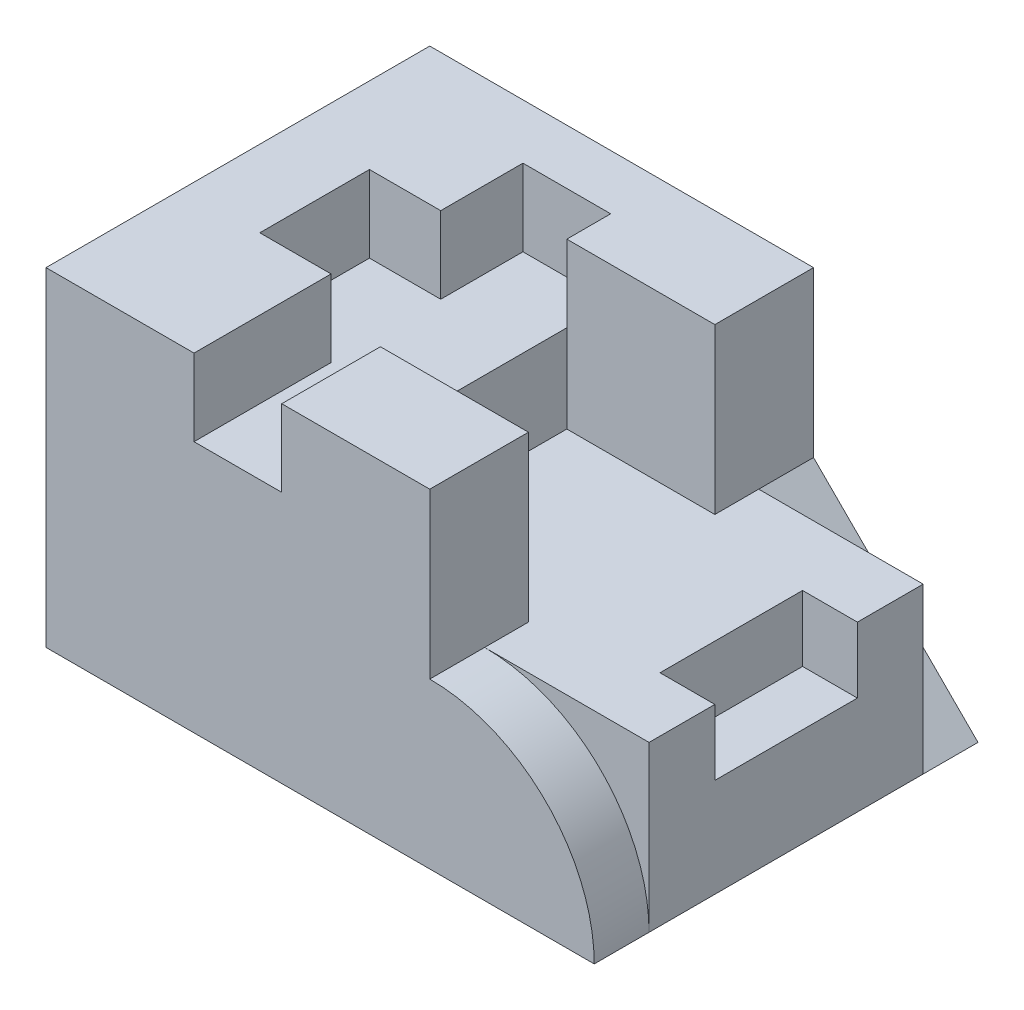
ISO-10303-21;
HEADER;
FILE_DESCRIPTION(('STEP AP214'),'2;1');
FILE_NAME('part.step','',(''),(''),'','','');
FILE_SCHEMA(('AUTOMOTIVE_DESIGN { 1 0 10303 214 1 1 1 1 }'));
ENDSEC;
DATA;
#1=APPLICATION_CONTEXT('core data for automotive mechanical design processes');
#2=APPLICATION_PROTOCOL_DEFINITION('international standard','automotive_design',2000,#1);
#3=PRODUCT_CONTEXT('',#1,'mechanical');
#4=PRODUCT('Part','Part','',(#3));
#5=PRODUCT_RELATED_PRODUCT_CATEGORY('part','',(#4));
#6=PRODUCT_DEFINITION_FORMATION('','',#4);
#7=PRODUCT_DEFINITION_CONTEXT('part definition',#1,'design');
#8=PRODUCT_DEFINITION('design','',#6,#7);
#9=PRODUCT_DEFINITION_SHAPE('','',#8);
#10=(LENGTH_UNIT() NAMED_UNIT(*) SI_UNIT(.MILLI.,.METRE.));
#11=(NAMED_UNIT(*) PLANE_ANGLE_UNIT() SI_UNIT($,.RADIAN.));
#12=(NAMED_UNIT(*) SI_UNIT($,.STERADIAN.) SOLID_ANGLE_UNIT());
#13=UNCERTAINTY_MEASURE_WITH_UNIT(LENGTH_MEASURE(1.E-05),#10,'distance_accuracy_value','');
#14=(GEOMETRIC_REPRESENTATION_CONTEXT(3) GLOBAL_UNCERTAINTY_ASSIGNED_CONTEXT((#13)) GLOBAL_UNIT_ASSIGNED_CONTEXT((#10,
#11,#12)) REPRESENTATION_CONTEXT('',''));
#15=CARTESIAN_POINT('',(0.,0.,0.));
#16=DIRECTION('',(0.,0.,1.));
#17=DIRECTION('',(1.,0.,0.));
#18=AXIS2_PLACEMENT_3D('',#15,#16,#17);
#19=CARTESIAN_POINT('',(0.,0.,35.));
#20=DIRECTION('',(0.,0.,-1.));
#21=DIRECTION('',(-1.,0.,0.));
#22=AXIS2_PLACEMENT_3D('',#19,#20,#21);
#23=PLANE('',#22);
#24=CARTESIAN_POINT('',(10.,-15.,35.));
#25=DIRECTION('',(0.,0.,1.));
#26=DIRECTION('',(1.,0.,0.));
#27=AXIS2_PLACEMENT_3D('',#24,#25,#26);
#28=CIRCLE('',#27,15.);
#29=CARTESIAN_POINT('',(25.,-15.,35.));
#30=VERTEX_POINT('',#29);
#31=CARTESIAN_POINT('',(10.,0.,35.));
#32=VERTEX_POINT('',#31);
#33=EDGE_CURVE('E229',#30,#32,#28,.T.);
#34=ORIENTED_EDGE('',*,*,#33,.T.);
#35=DIRECTION('',(0.,-1.,0.));
#36=VECTOR('',#35,1.);
#37=CARTESIAN_POINT('',(10.,15.,35.));
#38=LINE('',#37,#36);
#39=CARTESIAN_POINT('',(10.,15.,35.));
#40=VERTEX_POINT('',#39);
#41=EDGE_CURVE('E268',#40,#32,#38,.T.);
#42=ORIENTED_EDGE('',*,*,#41,.F.);
#43=DIRECTION('',(-1.,0.,0.));
#44=VECTOR('',#43,1.);
#45=CARTESIAN_POINT('',(-25.,15.,35.));
#46=LINE('',#45,#44);
#47=CARTESIAN_POINT('',(-3.5,15.,35.));
#48=VERTEX_POINT('',#47);
#49=EDGE_CURVE('E251',#40,#48,#46,.T.);
#50=ORIENTED_EDGE('',*,*,#49,.T.);
#51=DIRECTION('',(0.,1.,0.));
#52=VECTOR('',#51,1.);
#53=CARTESIAN_POINT('',(-3.5,8.,35.));
#54=LINE('',#53,#52);
#55=CARTESIAN_POINT('',(-3.5,8.,35.));
#56=VERTEX_POINT('',#55);
#57=EDGE_CURVE('E279',#56,#48,#54,.T.);
#58=ORIENTED_EDGE('',*,*,#57,.F.);
#59=DIRECTION('',(1.,0.,0.));
#60=VECTOR('',#59,1.);
#61=CARTESIAN_POINT('',(0.,8.,35.));
#62=LINE('',#61,#60);
#63=CARTESIAN_POINT('',(-11.5,8.,35.));
#64=VERTEX_POINT('',#63);
#65=EDGE_CURVE('E335',#64,#56,#62,.T.);
#66=ORIENTED_EDGE('',*,*,#65,.F.);
#67=DIRECTION('',(0.,1.,0.));
#68=VECTOR('',#67,1.);
#69=CARTESIAN_POINT('',(-11.5,8.,35.));
#70=LINE('',#69,#68);
#71=CARTESIAN_POINT('',(-11.5,15.,35.));
#72=VERTEX_POINT('',#71);
#73=EDGE_CURVE('E276',#64,#72,#70,.T.);
#74=ORIENTED_EDGE('',*,*,#73,.T.);
#75=CARTESIAN_POINT('',(-25.,15.,35.));
#76=VERTEX_POINT('',#75);
#77=EDGE_CURVE('E250',#72,#76,#46,.T.);
#78=ORIENTED_EDGE('',*,*,#77,.T.);
#79=DIRECTION('',(0.,-1.,0.));
#80=VECTOR('',#79,1.);
#81=CARTESIAN_POINT('',(-25.,-15.,35.));
#82=LINE('',#81,#80);
#83=CARTESIAN_POINT('',(-25.,-15.,35.));
#84=VERTEX_POINT('',#83);
#85=EDGE_CURVE('E236',#76,#84,#82,.T.);
#86=ORIENTED_EDGE('',*,*,#85,.T.);
#87=DIRECTION('',(1.,0.,0.));
#88=VECTOR('',#87,1.);
#89=CARTESIAN_POINT('',(-25.,-15.,35.));
#90=LINE('',#89,#88);
#91=EDGE_CURVE('E233',#84,#30,#90,.T.);
#92=ORIENTED_EDGE('',*,*,#91,.T.);
#93=EDGE_LOOP('',(#34,#42,#50,#58,#66,#74,#78,#86,#92));
#94=FACE_BOUND('',#93,.T.);
#95=ADVANCED_FACE('F32',(#94),#23,.F.);
#96=CARTESIAN_POINT('',(25.,-15.,35.));
#97=DIRECTION('',(-1.,0.,0.));
#98=DIRECTION('',(0.,0.,1.));
#99=AXIS2_PLACEMENT_3D('',#96,#97,#98);
#100=PLANE('',#99);
#101=DIRECTION('',(0.,0.,-1.));
#102=VECTOR('',#101,1.);
#103=CARTESIAN_POINT('',(25.,-15.,35.));
#104=LINE('',#103,#102);
#105=CARTESIAN_POINT('',(25.,-15.,30.));
#106=VERTEX_POINT('',#105);
#107=CARTESIAN_POINT('',(25.,-15.,5.));
#108=VERTEX_POINT('',#107);
#109=EDGE_CURVE('E225',#106,#108,#104,.T.);
#110=ORIENTED_EDGE('',*,*,#109,.T.);
#111=DIRECTION('',(0.,-1.,0.));
#112=VECTOR('',#111,1.);
#113=CARTESIAN_POINT('',(25.,0.,5.));
#114=LINE('',#113,#112);
#115=CARTESIAN_POINT('',(25.,0.,5.));
#116=VERTEX_POINT('',#115);
#117=EDGE_CURVE('E211',#116,#108,#114,.T.);
#118=ORIENTED_EDGE('',*,*,#117,.F.);
#119=DIRECTION('',(0.,0.,1.));
#120=VECTOR('',#119,1.);
#121=CARTESIAN_POINT('',(25.,0.,0.));
#122=LINE('',#121,#120);
#123=CARTESIAN_POINT('',(25.,0.,11.));
#124=VERTEX_POINT('',#123);
#125=EDGE_CURVE('E254',#116,#124,#122,.T.);
#126=ORIENTED_EDGE('',*,*,#125,.T.);
#127=DIRECTION('',(0.,1.,0.));
#128=VECTOR('',#127,1.);
#129=CARTESIAN_POINT('',(25.,-6.,11.));
#130=LINE('',#129,#128);
#131=CARTESIAN_POINT('',(25.,-6.,11.));
#132=VERTEX_POINT('',#131);
#133=EDGE_CURVE('E347',#132,#124,#130,.T.);
#134=ORIENTED_EDGE('',*,*,#133,.F.);
#135=DIRECTION('',(0.,0.,-1.));
#136=VECTOR('',#135,1.);
#137=CARTESIAN_POINT('',(25.,-6.,24.));
#138=LINE('',#137,#136);
#139=CARTESIAN_POINT('',(25.,-6.,24.));
#140=VERTEX_POINT('',#139);
#141=EDGE_CURVE('E362',#140,#132,#138,.T.);
#142=ORIENTED_EDGE('',*,*,#141,.F.);
#143=DIRECTION('',(0.,1.,0.));
#144=VECTOR('',#143,1.);
#145=CARTESIAN_POINT('',(25.,-6.,24.));
#146=LINE('',#145,#144);
#147=CARTESIAN_POINT('',(25.,0.,24.));
#148=VERTEX_POINT('',#147);
#149=EDGE_CURVE('E343',#140,#148,#146,.T.);
#150=ORIENTED_EDGE('',*,*,#149,.T.);
#151=CARTESIAN_POINT('',(25.,0.,30.));
#152=VERTEX_POINT('',#151);
#153=EDGE_CURVE('E265',#148,#152,#122,.T.);
#154=ORIENTED_EDGE('',*,*,#153,.T.);
#155=DIRECTION('',(0.,1.,0.));
#156=VECTOR('',#155,1.);
#157=CARTESIAN_POINT('',(25.,0.,30.));
#158=LINE('',#157,#156);
#159=EDGE_CURVE('E47',#106,#152,#158,.T.);
#160=ORIENTED_EDGE('',*,*,#159,.F.);
#161=EDGE_LOOP('',(#110,#118,#126,#134,#142,#150,#154,#160));
#162=FACE_BOUND('',#161,.T.);
#163=ADVANCED_FACE('F34',(#162),#100,.F.);
#164=CARTESIAN_POINT('',(25.,0.,0.));
#165=DIRECTION('',(0.,-1.,0.));
#166=DIRECTION('',(1.,0.,0.));
#167=AXIS2_PLACEMENT_3D('',#164,#165,#166);
#168=PLANE('',#167);
#169=ORIENTED_EDGE('',*,*,#125,.F.);
#170=DIRECTION('',(1.,0.,0.));
#171=VECTOR('',#170,1.);
#172=CARTESIAN_POINT('',(10.,0.,5.));
#173=LINE('',#172,#171);
#174=CARTESIAN_POINT('',(10.,0.,5.));
#175=VERTEX_POINT('',#174);
#176=EDGE_CURVE('E210',#175,#116,#173,.T.);
#177=ORIENTED_EDGE('',*,*,#176,.F.);
#178=DIRECTION('',(0.,0.,1.));
#179=VECTOR('',#178,1.);
#180=CARTESIAN_POINT('',(10.,0.,0.));
#181=LINE('',#180,#179);
#182=CARTESIAN_POINT('',(10.,0.,9.));
#183=VERTEX_POINT('',#182);
#184=EDGE_CURVE('E266',#175,#183,#181,.T.);
#185=ORIENTED_EDGE('',*,*,#184,.T.);
#186=DIRECTION('',(-1.,0.,0.));
#187=VECTOR('',#186,1.);
#188=CARTESIAN_POINT('',(10.,0.,9.));
#189=LINE('',#188,#187);
#190=CARTESIAN_POINT('',(-3.5,0.,9.));
#191=VERTEX_POINT('',#190);
#192=EDGE_CURVE('E378',#183,#191,#189,.T.);
#193=ORIENTED_EDGE('',*,*,#192,.T.);
#194=DIRECTION('',(0.,0.,-1.));
#195=VECTOR('',#194,1.);
#196=CARTESIAN_POINT('',(-3.5,0.,0.));
#197=LINE('',#196,#195);
#198=CARTESIAN_POINT('',(-3.5,0.,26.));
#199=VERTEX_POINT('',#198);
#200=EDGE_CURVE('E272',#199,#191,#197,.T.);
#201=ORIENTED_EDGE('',*,*,#200,.F.);
#202=DIRECTION('',(1.,0.,0.));
#203=VECTOR('',#202,1.);
#204=CARTESIAN_POINT('',(10.,0.,26.));
#205=LINE('',#204,#203);
#206=CARTESIAN_POINT('',(10.,0.,26.));
#207=VERTEX_POINT('',#206);
#208=EDGE_CURVE('E376',#199,#207,#205,.T.);
#209=ORIENTED_EDGE('',*,*,#208,.T.);
#210=CARTESIAN_POINT('',(10.,0.,30.));
#211=VERTEX_POINT('',#210);
#212=EDGE_CURVE('E262',#207,#211,#181,.T.);
#213=ORIENTED_EDGE('',*,*,#212,.T.);
#214=DIRECTION('',(-1.,0.,0.));
#215=VECTOR('',#214,1.);
#216=CARTESIAN_POINT('',(0.,0.,30.));
#217=LINE('',#216,#215);
#218=EDGE_CURVE('E391',#152,#211,#217,.T.);
#219=ORIENTED_EDGE('',*,*,#218,.F.);
#220=ORIENTED_EDGE('',*,*,#153,.F.);
#221=DIRECTION('',(1.,0.,0.));
#222=VECTOR('',#221,1.);
#223=CARTESIAN_POINT('',(25.,0.,24.));
#224=LINE('',#223,#222);
#225=CARTESIAN_POINT('',(20.,0.,24.));
#226=VERTEX_POINT('',#225);
#227=EDGE_CURVE('E355',#226,#148,#224,.T.);
#228=ORIENTED_EDGE('',*,*,#227,.F.);
#229=DIRECTION('',(0.,0.,1.));
#230=VECTOR('',#229,1.);
#231=CARTESIAN_POINT('',(20.,0.,24.));
#232=LINE('',#231,#230);
#233=CARTESIAN_POINT('',(20.,0.,11.));
#234=VERTEX_POINT('',#233);
#235=EDGE_CURVE('E357',#234,#226,#232,.T.);
#236=ORIENTED_EDGE('',*,*,#235,.F.);
#237=DIRECTION('',(-1.,0.,0.));
#238=VECTOR('',#237,1.);
#239=CARTESIAN_POINT('',(25.,0.,11.));
#240=LINE('',#239,#238);
#241=EDGE_CURVE('E351',#124,#234,#240,.T.);
#242=ORIENTED_EDGE('',*,*,#241,.F.);
#243=EDGE_LOOP('',(#169,#177,#185,#193,#201,#209,#213,#219,#220,#228,#236,#242));
#244=FACE_BOUND('',#243,.T.);
#245=ADVANCED_FACE('F448',(#244),#168,.F.);
#246=CARTESIAN_POINT('',(-25.,15.,35.));
#247=DIRECTION('',(0.,-1.,0.));
#248=DIRECTION('',(0.,0.,-1.));
#249=AXIS2_PLACEMENT_3D('',#246,#247,#248);
#250=PLANE('',#249);
#251=DIRECTION('',(0.,0.,-1.));
#252=VECTOR('',#251,1.);
#253=CARTESIAN_POINT('',(-3.5,15.,0.));
#254=LINE('',#253,#252);
#255=CARTESIAN_POINT('',(-3.5,15.,9.));
#256=VERTEX_POINT('',#255);
#257=CARTESIAN_POINT('',(-3.5,15.,5.));
#258=VERTEX_POINT('',#257);
#259=EDGE_CURVE('E314',#256,#258,#254,.T.);
#260=ORIENTED_EDGE('',*,*,#259,.F.);
#261=DIRECTION('',(-1.,0.,0.));
#262=VECTOR('',#261,1.);
#263=CARTESIAN_POINT('',(10.,15.,9.));
#264=LINE('',#263,#262);
#265=CARTESIAN_POINT('',(10.,15.,9.));
#266=VERTEX_POINT('',#265);
#267=EDGE_CURVE('E385',#266,#256,#264,.T.);
#268=ORIENTED_EDGE('',*,*,#267,.F.);
#269=DIRECTION('',(0.,0.,1.));
#270=VECTOR('',#269,1.);
#271=CARTESIAN_POINT('',(10.,15.,0.));
#272=LINE('',#271,#270);
#273=CARTESIAN_POINT('',(10.,15.,0.));
#274=VERTEX_POINT('',#273);
#275=EDGE_CURVE('E259',#274,#266,#272,.T.);
#276=ORIENTED_EDGE('',*,*,#275,.F.);
#277=DIRECTION('',(-1.,0.,0.));
#278=VECTOR('',#277,1.);
#279=CARTESIAN_POINT('',(-25.,15.,0.));
#280=LINE('',#279,#278);
#281=CARTESIAN_POINT('',(-25.,15.,0.));
#282=VERTEX_POINT('',#281);
#283=EDGE_CURVE('E253',#274,#282,#280,.T.);
#284=ORIENTED_EDGE('',*,*,#283,.T.);
#285=DIRECTION('',(0.,0.,-1.));
#286=VECTOR('',#285,1.);
#287=CARTESIAN_POINT('',(-25.,15.,35.));
#288=LINE('',#287,#286);
#289=EDGE_CURVE('E11',#76,#282,#288,.T.);
#290=ORIENTED_EDGE('',*,*,#289,.F.);
#291=ORIENTED_EDGE('',*,*,#77,.F.);
#292=DIRECTION('',(0.,0.,-1.));
#293=VECTOR('',#292,1.);
#294=CARTESIAN_POINT('',(-11.5,15.,0.));
#295=LINE('',#294,#293);
#296=CARTESIAN_POINT('',(-11.5,15.,22.5));
#297=VERTEX_POINT('',#296);
#298=EDGE_CURVE('E315',#72,#297,#295,.T.);
#299=ORIENTED_EDGE('',*,*,#298,.T.);
#300=DIRECTION('',(-1.,0.,0.));
#301=VECTOR('',#300,1.);
#302=CARTESIAN_POINT('',(0.,15.,22.5));
#303=LINE('',#302,#301);
#304=CARTESIAN_POINT('',(-18.,15.,22.5));
#305=VERTEX_POINT('',#304);
#306=EDGE_CURVE('E295',#297,#305,#303,.T.);
#307=ORIENTED_EDGE('',*,*,#306,.T.);
#308=DIRECTION('',(0.,0.,-1.));
#309=VECTOR('',#308,1.);
#310=CARTESIAN_POINT('',(-18.,15.,0.));
#311=LINE('',#310,#309);
#312=CARTESIAN_POINT('',(-18.,15.,12.5));
#313=VERTEX_POINT('',#312);
#314=EDGE_CURVE('E299',#305,#313,#311,.T.);
#315=ORIENTED_EDGE('',*,*,#314,.T.);
#316=DIRECTION('',(-1.,0.,0.));
#317=VECTOR('',#316,1.);
#318=CARTESIAN_POINT('',(0.,15.,12.5));
#319=LINE('',#318,#317);
#320=CARTESIAN_POINT('',(-11.5,15.,12.5));
#321=VERTEX_POINT('',#320);
#322=EDGE_CURVE('E302',#321,#313,#319,.T.);
#323=ORIENTED_EDGE('',*,*,#322,.F.);
#324=DIRECTION('',(0.,0.,-1.));
#325=VECTOR('',#324,1.);
#326=CARTESIAN_POINT('',(-11.5,15.,0.));
#327=LINE('',#326,#325);
#328=CARTESIAN_POINT('',(-11.5,15.,5.00000000000001));
#329=VERTEX_POINT('',#328);
#330=EDGE_CURVE('E305',#321,#329,#327,.T.);
#331=ORIENTED_EDGE('',*,*,#330,.T.);
#332=DIRECTION('',(-1.,0.,0.));
#333=VECTOR('',#332,1.);
#334=CARTESIAN_POINT('',(0.,15.,5.));
#335=LINE('',#334,#333);
#336=EDGE_CURVE('E308',#258,#329,#335,.T.);
#337=ORIENTED_EDGE('',*,*,#336,.F.);
#338=EDGE_LOOP('',(#260,#268,#276,#284,#290,#291,#299,#307,#315,#323,#331,#337));
#339=FACE_BOUND('',#338,.T.);
#340=ADVANCED_FACE('F407',(#339),#250,.F.);
#341=CARTESIAN_POINT('',(-3.5,-16.8002976164115,0.));
#342=DIRECTION('',(1.,0.,0.));
#343=DIRECTION('',(0.,0.,-1.));
#344=AXIS2_PLACEMENT_3D('',#341,#342,#343);
#345=PLANE('',#344);
#346=ORIENTED_EDGE('',*,*,#200,.T.);
#347=DIRECTION('',(0.,1.,0.));
#348=VECTOR('',#347,1.);
#349=CARTESIAN_POINT('',(-3.5,-21.7082933460924,9.));
#350=LINE('',#349,#348);
#351=CARTESIAN_POINT('',(-3.5,8.,9.));
#352=VERTEX_POINT('',#351);
#353=EDGE_CURVE('E55',#191,#352,#350,.T.);
#354=ORIENTED_EDGE('',*,*,#353,.T.);
#355=DIRECTION('',(0.,0.,-1.));
#356=VECTOR('',#355,1.);
#357=CARTESIAN_POINT('',(-3.5,8.,0.));
#358=LINE('',#357,#356);
#359=CARTESIAN_POINT('',(-3.5,8.,26.));
#360=VERTEX_POINT('',#359);
#361=EDGE_CURVE('E333',#360,#352,#358,.T.);
#362=ORIENTED_EDGE('',*,*,#361,.F.);
#363=DIRECTION('',(0.,1.,0.));
#364=VECTOR('',#363,1.);
#365=CARTESIAN_POINT('',(-3.5,-21.7082933460924,26.));
#366=LINE('',#365,#364);
#367=EDGE_CURVE('E359',#199,#360,#366,.T.);
#368=ORIENTED_EDGE('',*,*,#367,.F.);
#369=EDGE_LOOP('',(#346,#354,#362,#368));
#370=FACE_BOUND('',#369,.T.);
#371=ADVANCED_FACE('F472',(#370),#345,.T.);
#372=CARTESIAN_POINT('',(10.,15.,0.));
#373=DIRECTION('',(-1.,0.,0.));
#374=DIRECTION('',(0.,-1.,0.));
#375=AXIS2_PLACEMENT_3D('',#372,#373,#374);
#376=PLANE('',#375);
#377=ORIENTED_EDGE('',*,*,#212,.F.);
#378=DIRECTION('',(0.,1.,0.));
#379=VECTOR('',#378,1.);
#380=CARTESIAN_POINT('',(10.,-21.7082933460924,26.));
#381=LINE('',#380,#379);
#382=CARTESIAN_POINT('',(10.,15.,26.));
#383=VERTEX_POINT('',#382);
#384=EDGE_CURVE('E372',#207,#383,#381,.T.);
#385=ORIENTED_EDGE('',*,*,#384,.T.);
#386=EDGE_CURVE('E263',#383,#40,#272,.T.);
#387=ORIENTED_EDGE('',*,*,#386,.T.);
#388=ORIENTED_EDGE('',*,*,#41,.T.);
#389=DIRECTION('',(0.,0.,1.));
#390=VECTOR('',#389,1.);
#391=CARTESIAN_POINT('',(10.,0.,30.));
#392=LINE('',#391,#390);
#393=EDGE_CURVE('E388',#211,#32,#392,.T.);
#394=ORIENTED_EDGE('',*,*,#393,.F.);
#395=EDGE_LOOP('',(#377,#385,#387,#388,#394));
#396=FACE_BOUND('',#395,.T.);
#397=ADVANCED_FACE('F455',(#396),#376,.F.);
#398=ORIENTED_EDGE('',*,*,#386,.F.);
#399=DIRECTION('',(1.,0.,0.));
#400=VECTOR('',#399,1.);
#401=CARTESIAN_POINT('',(10.,15.,26.));
#402=LINE('',#401,#400);
#403=CARTESIAN_POINT('',(-3.5,15.,26.));
#404=VERTEX_POINT('',#403);
#405=EDGE_CURVE('E386',#404,#383,#402,.T.);
#406=ORIENTED_EDGE('',*,*,#405,.F.);
#407=EDGE_CURVE('E311',#48,#404,#254,.T.);
#408=ORIENTED_EDGE('',*,*,#407,.F.);
#409=ORIENTED_EDGE('',*,*,#49,.F.);
#410=EDGE_LOOP('',(#398,#406,#408,#409));
#411=FACE_BOUND('',#410,.T.);
#412=ADVANCED_FACE('F464',(#411),#250,.F.);
#413=CARTESIAN_POINT('',(-25.,-15.,35.));
#414=DIRECTION('',(1.,0.,0.));
#415=DIRECTION('',(0.,0.,-1.));
#416=AXIS2_PLACEMENT_3D('',#413,#414,#415);
#417=PLANE('',#416);
#418=DIRECTION('',(0.,-1.,0.));
#419=VECTOR('',#418,1.);
#420=CARTESIAN_POINT('',(-25.,-15.,0.));
#421=LINE('',#420,#419);
#422=CARTESIAN_POINT('',(-25.,-15.,0.));
#423=VERTEX_POINT('',#422);
#424=EDGE_CURVE('E248',#282,#423,#421,.T.);
#425=ORIENTED_EDGE('',*,*,#424,.T.);
#426=DIRECTION('',(0.,0.,-1.));
#427=VECTOR('',#426,1.);
#428=CARTESIAN_POINT('',(-25.,-15.,35.));
#429=LINE('',#428,#427);
#430=EDGE_CURVE('E40',#84,#423,#429,.T.);
#431=ORIENTED_EDGE('',*,*,#430,.F.);
#432=ORIENTED_EDGE('',*,*,#85,.F.);
#433=ORIENTED_EDGE('',*,*,#289,.T.);
#434=EDGE_LOOP('',(#425,#431,#432,#433));
#435=FACE_BOUND('',#434,.T.);
#436=ADVANCED_FACE('F410',(#435),#417,.F.);
#437=CARTESIAN_POINT('',(-25.,-15.,35.));
#438=DIRECTION('',(0.,1.,0.));
#439=DIRECTION('',(0.,0.,1.));
#440=AXIS2_PLACEMENT_3D('',#437,#438,#439);
#441=PLANE('',#440);
#442=DIRECTION('',(1.,0.,0.));
#443=VECTOR('',#442,1.);
#444=CARTESIAN_POINT('',(-25.,-15.,0.));
#445=LINE('',#444,#443);
#446=CARTESIAN_POINT('',(25.,-15.,0.));
#447=VERTEX_POINT('',#446);
#448=EDGE_CURVE('E228',#423,#447,#445,.T.);
#449=ORIENTED_EDGE('',*,*,#448,.T.);
#450=DIRECTION('',(0.,0.,-1.));
#451=VECTOR('',#450,1.);
#452=CARTESIAN_POINT('',(25.,-15.,5.));
#453=LINE('',#452,#451);
#454=EDGE_CURVE('E204',#108,#447,#453,.T.);
#455=ORIENTED_EDGE('',*,*,#454,.F.);
#456=ORIENTED_EDGE('',*,*,#109,.F.);
#457=EDGE_CURVE('E232',#30,#106,#104,.T.);
#458=ORIENTED_EDGE('',*,*,#457,.F.);
#459=ORIENTED_EDGE('',*,*,#91,.F.);
#460=ORIENTED_EDGE('',*,*,#430,.T.);
#461=EDGE_LOOP('',(#449,#455,#456,#458,#459,#460));
#462=FACE_BOUND('',#461,.T.);
#463=ADVANCED_FACE('F223',(#462),#441,.F.);
#464=CARTESIAN_POINT('',(0.,0.,0.));
#465=DIRECTION('',(0.,0.,-1.));
#466=DIRECTION('',(-1.,0.,0.));
#467=AXIS2_PLACEMENT_3D('',#464,#465,#466);
#468=PLANE('',#467);
#469=DIRECTION('',(-0.707106781186548,0.707106781186548,0.));
#470=VECTOR('',#469,1.);
#471=CARTESIAN_POINT('',(25.,-15.,0.));
#472=LINE('',#471,#470);
#473=CARTESIAN_POINT('',(10.,0.,0.));
#474=VERTEX_POINT('',#473);
#475=EDGE_CURVE('E218',#447,#474,#472,.T.);
#476=ORIENTED_EDGE('',*,*,#475,.F.);
#477=ORIENTED_EDGE('',*,*,#448,.F.);
#478=ORIENTED_EDGE('',*,*,#424,.F.);
#479=ORIENTED_EDGE('',*,*,#283,.F.);
#480=DIRECTION('',(0.,-1.,0.));
#481=VECTOR('',#480,1.);
#482=CARTESIAN_POINT('',(10.,15.,0.));
#483=LINE('',#482,#481);
#484=EDGE_CURVE('E271',#274,#474,#483,.T.);
#485=ORIENTED_EDGE('',*,*,#484,.T.);
#486=EDGE_LOOP('',(#476,#477,#478,#479,#485));
#487=FACE_BOUND('',#486,.T.);
#488=ADVANCED_FACE('F246',(#487),#468,.T.);
#489=ORIENTED_EDGE('',*,*,#275,.T.);
#490=DIRECTION('',(0.,1.,0.));
#491=VECTOR('',#490,1.);
#492=CARTESIAN_POINT('',(10.,-21.7082933460924,9.));
#493=LINE('',#492,#491);
#494=EDGE_CURVE('E375',#183,#266,#493,.T.);
#495=ORIENTED_EDGE('',*,*,#494,.F.);
#496=ORIENTED_EDGE('',*,*,#184,.F.);
#497=EDGE_CURVE('E207',#474,#175,#181,.T.);
#498=ORIENTED_EDGE('',*,*,#497,.F.);
#499=ORIENTED_EDGE('',*,*,#484,.F.);
#500=EDGE_LOOP('',(#489,#495,#496,#498,#499));
#501=FACE_BOUND('',#500,.T.);
#502=ADVANCED_FACE('F401',(#501),#376,.F.);
#503=CARTESIAN_POINT('',(-3.5,8.,0.));
#504=DIRECTION('',(1.,0.,0.));
#505=DIRECTION('',(0.,0.,-1.));
#506=AXIS2_PLACEMENT_3D('',#503,#504,#505);
#507=PLANE('',#506);
#508=CARTESIAN_POINT('',(-3.5,8.,5.));
#509=VERTEX_POINT('',#508);
#510=EDGE_CURVE('E334',#352,#509,#358,.T.);
#511=ORIENTED_EDGE('',*,*,#510,.F.);
#512=EDGE_CURVE('E380',#352,#256,#350,.T.);
#513=ORIENTED_EDGE('',*,*,#512,.T.);
#514=ORIENTED_EDGE('',*,*,#259,.T.);
#515=DIRECTION('',(0.,1.,0.));
#516=VECTOR('',#515,1.);
#517=CARTESIAN_POINT('',(-3.5,8.,5.));
#518=LINE('',#517,#516);
#519=EDGE_CURVE('E282',#509,#258,#518,.T.);
#520=ORIENTED_EDGE('',*,*,#519,.F.);
#521=EDGE_LOOP('',(#511,#513,#514,#520));
#522=FACE_BOUND('',#521,.T.);
#523=ADVANCED_FACE('F442',(#522),#507,.F.);
#524=CARTESIAN_POINT('',(-11.5,8.,0.));
#525=DIRECTION('',(1.,0.,0.));
#526=DIRECTION('',(0.,0.,-1.));
#527=AXIS2_PLACEMENT_3D('',#524,#525,#526);
#528=PLANE('',#527);
#529=ORIENTED_EDGE('',*,*,#298,.F.);
#530=ORIENTED_EDGE('',*,*,#73,.F.);
#531=DIRECTION('',(0.,0.,-1.));
#532=VECTOR('',#531,1.);
#533=CARTESIAN_POINT('',(-11.5,8.,0.));
#534=LINE('',#533,#532);
#535=CARTESIAN_POINT('',(-11.5,8.,22.5));
#536=VERTEX_POINT('',#535);
#537=EDGE_CURVE('E298',#64,#536,#534,.T.);
#538=ORIENTED_EDGE('',*,*,#537,.T.);
#539=DIRECTION('',(0.,1.,0.));
#540=VECTOR('',#539,1.);
#541=CARTESIAN_POINT('',(-11.5,8.,22.5));
#542=LINE('',#541,#540);
#543=EDGE_CURVE('E275',#536,#297,#542,.T.);
#544=ORIENTED_EDGE('',*,*,#543,.T.);
#545=EDGE_LOOP('',(#529,#530,#538,#544));
#546=FACE_BOUND('',#545,.T.);
#547=ADVANCED_FACE('F414',(#546),#528,.T.);
#548=CARTESIAN_POINT('',(0.,8.,22.5));
#549=DIRECTION('',(0.,0.,-1.));
#550=DIRECTION('',(-1.,0.,0.));
#551=AXIS2_PLACEMENT_3D('',#548,#549,#550);
#552=PLANE('',#551);
#553=ORIENTED_EDGE('',*,*,#306,.F.);
#554=ORIENTED_EDGE('',*,*,#543,.F.);
#555=DIRECTION('',(-1.,0.,0.));
#556=VECTOR('',#555,1.);
#557=CARTESIAN_POINT('',(0.,8.,22.5));
#558=LINE('',#557,#556);
#559=CARTESIAN_POINT('',(-18.,8.,22.5));
#560=VERTEX_POINT('',#559);
#561=EDGE_CURVE('E280',#536,#560,#558,.T.);
#562=ORIENTED_EDGE('',*,*,#561,.T.);
#563=DIRECTION('',(0.,1.,0.));
#564=VECTOR('',#563,1.);
#565=CARTESIAN_POINT('',(-18.,8.,22.5));
#566=LINE('',#565,#564);
#567=EDGE_CURVE('E291',#560,#305,#566,.T.);
#568=ORIENTED_EDGE('',*,*,#567,.T.);
#569=EDGE_LOOP('',(#553,#554,#562,#568));
#570=FACE_BOUND('',#569,.T.);
#571=ADVANCED_FACE('F418',(#570),#552,.T.);
#572=CARTESIAN_POINT('',(-18.,8.,0.));
#573=DIRECTION('',(1.,0.,0.));
#574=DIRECTION('',(0.,0.,-1.));
#575=AXIS2_PLACEMENT_3D('',#572,#573,#574);
#576=PLANE('',#575);
#577=ORIENTED_EDGE('',*,*,#314,.F.);
#578=ORIENTED_EDGE('',*,*,#567,.F.);
#579=DIRECTION('',(0.,0.,-1.));
#580=VECTOR('',#579,1.);
#581=CARTESIAN_POINT('',(-18.,8.,0.));
#582=LINE('',#581,#580);
#583=CARTESIAN_POINT('',(-18.,8.,12.5));
#584=VERTEX_POINT('',#583);
#585=EDGE_CURVE('E320',#560,#584,#582,.T.);
#586=ORIENTED_EDGE('',*,*,#585,.T.);
#587=DIRECTION('',(0.,1.,0.));
#588=VECTOR('',#587,1.);
#589=CARTESIAN_POINT('',(-18.,8.,12.5));
#590=LINE('',#589,#588);
#591=EDGE_CURVE('E289',#584,#313,#590,.T.);
#592=ORIENTED_EDGE('',*,*,#591,.T.);
#593=EDGE_LOOP('',(#577,#578,#586,#592));
#594=FACE_BOUND('',#593,.T.);
#595=ADVANCED_FACE('F423',(#594),#576,.T.);
#596=CARTESIAN_POINT('',(0.,8.,12.5));
#597=DIRECTION('',(0.,0.,-1.));
#598=DIRECTION('',(-1.,0.,0.));
#599=AXIS2_PLACEMENT_3D('',#596,#597,#598);
#600=PLANE('',#599);
#601=ORIENTED_EDGE('',*,*,#322,.T.);
#602=ORIENTED_EDGE('',*,*,#591,.F.);
#603=DIRECTION('',(-1.,0.,0.));
#604=VECTOR('',#603,1.);
#605=CARTESIAN_POINT('',(0.,8.,12.5));
#606=LINE('',#605,#604);
#607=CARTESIAN_POINT('',(-11.5,8.,12.5));
#608=VERTEX_POINT('',#607);
#609=EDGE_CURVE('E322',#608,#584,#606,.T.);
#610=ORIENTED_EDGE('',*,*,#609,.F.);
#611=DIRECTION('',(0.,1.,0.));
#612=VECTOR('',#611,1.);
#613=CARTESIAN_POINT('',(-11.5,8.,12.5));
#614=LINE('',#613,#612);
#615=EDGE_CURVE('E287',#608,#321,#614,.T.);
#616=ORIENTED_EDGE('',*,*,#615,.T.);
#617=EDGE_LOOP('',(#601,#602,#610,#616));
#618=FACE_BOUND('',#617,.T.);
#619=ADVANCED_FACE('F429',(#618),#600,.F.);
#620=CARTESIAN_POINT('',(-11.5,8.,0.));
#621=DIRECTION('',(1.,0.,0.));
#622=DIRECTION('',(0.,0.,-1.));
#623=AXIS2_PLACEMENT_3D('',#620,#621,#622);
#624=PLANE('',#623);
#625=ORIENTED_EDGE('',*,*,#330,.F.);
#626=ORIENTED_EDGE('',*,*,#615,.F.);
#627=DIRECTION('',(0.,0.,-1.));
#628=VECTOR('',#627,1.);
#629=CARTESIAN_POINT('',(-11.5,8.,0.));
#630=LINE('',#629,#628);
#631=CARTESIAN_POINT('',(-11.5,8.,5.00000000000001));
#632=VERTEX_POINT('',#631);
#633=EDGE_CURVE('E325',#608,#632,#630,.T.);
#634=ORIENTED_EDGE('',*,*,#633,.T.);
#635=DIRECTION('',(0.,1.,0.));
#636=VECTOR('',#635,1.);
#637=CARTESIAN_POINT('',(-11.5,8.,5.00000000000001));
#638=LINE('',#637,#636);
#639=EDGE_CURVE('E285',#632,#329,#638,.T.);
#640=ORIENTED_EDGE('',*,*,#639,.T.);
#641=EDGE_LOOP('',(#625,#626,#634,#640));
#642=FACE_BOUND('',#641,.T.);
#643=ADVANCED_FACE('F433',(#642),#624,.T.);
#644=CARTESIAN_POINT('',(0.,8.,5.));
#645=DIRECTION('',(0.,0.,-1.));
#646=DIRECTION('',(-1.,0.,0.));
#647=AXIS2_PLACEMENT_3D('',#644,#645,#646);
#648=PLANE('',#647);
#649=ORIENTED_EDGE('',*,*,#336,.T.);
#650=ORIENTED_EDGE('',*,*,#639,.F.);
#651=DIRECTION('',(-1.,0.,0.));
#652=VECTOR('',#651,1.);
#653=CARTESIAN_POINT('',(0.,8.,5.));
#654=LINE('',#653,#652);
#655=EDGE_CURVE('E327',#509,#632,#654,.T.);
#656=ORIENTED_EDGE('',*,*,#655,.F.);
#657=ORIENTED_EDGE('',*,*,#519,.T.);
#658=EDGE_LOOP('',(#649,#650,#656,#657));
#659=FACE_BOUND('',#658,.T.);
#660=ADVANCED_FACE('F437',(#659),#648,.F.);
#661=ORIENTED_EDGE('',*,*,#407,.T.);
#662=EDGE_CURVE('E371',#360,#404,#366,.T.);
#663=ORIENTED_EDGE('',*,*,#662,.F.);
#664=EDGE_CURVE('E330',#56,#360,#358,.T.);
#665=ORIENTED_EDGE('',*,*,#664,.F.);
#666=ORIENTED_EDGE('',*,*,#57,.T.);
#667=EDGE_LOOP('',(#661,#663,#665,#666));
#668=FACE_BOUND('',#667,.T.);
#669=ADVANCED_FACE('F468',(#668),#507,.F.);
#670=CARTESIAN_POINT('',(0.,8.,0.));
#671=DIRECTION('',(0.,1.,0.));
#672=DIRECTION('',(0.,0.,1.));
#673=AXIS2_PLACEMENT_3D('',#670,#671,#672);
#674=PLANE('',#673);
#675=ORIENTED_EDGE('',*,*,#537,.F.);
#676=ORIENTED_EDGE('',*,*,#65,.T.);
#677=ORIENTED_EDGE('',*,*,#664,.T.);
#678=ORIENTED_EDGE('',*,*,#361,.T.);
#679=ORIENTED_EDGE('',*,*,#510,.T.);
#680=ORIENTED_EDGE('',*,*,#655,.T.);
#681=ORIENTED_EDGE('',*,*,#633,.F.);
#682=ORIENTED_EDGE('',*,*,#609,.T.);
#683=ORIENTED_EDGE('',*,*,#585,.F.);
#684=ORIENTED_EDGE('',*,*,#561,.F.);
#685=EDGE_LOOP('',(#675,#676,#677,#678,#679,#680,#681,#682,#683,#684));
#686=FACE_BOUND('',#685,.T.);
#687=ADVANCED_FACE('F470',(#686),#674,.T.);
#688=CARTESIAN_POINT('',(20.,-6.,24.));
#689=DIRECTION('',(-1.,0.,0.));
#690=DIRECTION('',(0.,-1.,0.));
#691=AXIS2_PLACEMENT_3D('',#688,#689,#690);
#692=PLANE('',#691);
#693=ORIENTED_EDGE('',*,*,#235,.T.);
#694=DIRECTION('',(0.,1.,0.));
#695=VECTOR('',#694,1.);
#696=CARTESIAN_POINT('',(20.,-6.,24.));
#697=LINE('',#696,#695);
#698=CARTESIAN_POINT('',(20.,-6.,24.));
#699=VERTEX_POINT('',#698);
#700=EDGE_CURVE('E340',#699,#226,#697,.T.);
#701=ORIENTED_EDGE('',*,*,#700,.F.);
#702=DIRECTION('',(0.,0.,1.));
#703=VECTOR('',#702,1.);
#704=CARTESIAN_POINT('',(20.,-6.,24.));
#705=LINE('',#704,#703);
#706=CARTESIAN_POINT('',(20.,-6.,11.));
#707=VERTEX_POINT('',#706);
#708=EDGE_CURVE('E354',#707,#699,#705,.T.);
#709=ORIENTED_EDGE('',*,*,#708,.F.);
#710=DIRECTION('',(0.,1.,0.));
#711=VECTOR('',#710,1.);
#712=CARTESIAN_POINT('',(20.,-6.,11.));
#713=LINE('',#712,#711);
#714=EDGE_CURVE('E318',#707,#234,#713,.T.);
#715=ORIENTED_EDGE('',*,*,#714,.T.);
#716=EDGE_LOOP('',(#693,#701,#709,#715));
#717=FACE_BOUND('',#716,.T.);
#718=ADVANCED_FACE('F528',(#717),#692,.F.);
#719=CARTESIAN_POINT('',(25.,-6.,11.));
#720=DIRECTION('',(0.,0.,-1.));
#721=DIRECTION('',(-1.,0.,0.));
#722=AXIS2_PLACEMENT_3D('',#719,#720,#721);
#723=PLANE('',#722);
#724=ORIENTED_EDGE('',*,*,#241,.T.);
#725=ORIENTED_EDGE('',*,*,#714,.F.);
#726=DIRECTION('',(-1.,0.,0.));
#727=VECTOR('',#726,1.);
#728=CARTESIAN_POINT('',(25.,-6.,11.));
#729=LINE('',#728,#727);
#730=EDGE_CURVE('E344',#132,#707,#729,.T.);
#731=ORIENTED_EDGE('',*,*,#730,.F.);
#732=ORIENTED_EDGE('',*,*,#133,.T.);
#733=EDGE_LOOP('',(#724,#725,#731,#732));
#734=FACE_BOUND('',#733,.T.);
#735=ADVANCED_FACE('F531',(#734),#723,.F.);
#736=CARTESIAN_POINT('',(25.,-6.,24.));
#737=DIRECTION('',(0.,0.,1.));
#738=DIRECTION('',(1.,0.,0.));
#739=AXIS2_PLACEMENT_3D('',#736,#737,#738);
#740=PLANE('',#739);
#741=ORIENTED_EDGE('',*,*,#227,.T.);
#742=ORIENTED_EDGE('',*,*,#149,.F.);
#743=DIRECTION('',(1.,0.,0.));
#744=VECTOR('',#743,1.);
#745=CARTESIAN_POINT('',(25.,-6.,24.));
#746=LINE('',#745,#744);
#747=EDGE_CURVE('E364',#699,#140,#746,.T.);
#748=ORIENTED_EDGE('',*,*,#747,.F.);
#749=ORIENTED_EDGE('',*,*,#700,.T.);
#750=EDGE_LOOP('',(#741,#742,#748,#749));
#751=FACE_BOUND('',#750,.T.);
#752=ADVANCED_FACE('F483',(#751),#740,.F.);
#753=CARTESIAN_POINT('',(0.,-6.,0.));
#754=DIRECTION('',(0.,1.,0.));
#755=DIRECTION('',(-1.,0.,0.));
#756=AXIS2_PLACEMENT_3D('',#753,#754,#755);
#757=PLANE('',#756);
#758=ORIENTED_EDGE('',*,*,#708,.T.);
#759=ORIENTED_EDGE('',*,*,#747,.T.);
#760=ORIENTED_EDGE('',*,*,#141,.T.);
#761=ORIENTED_EDGE('',*,*,#730,.T.);
#762=EDGE_LOOP('',(#758,#759,#760,#761));
#763=FACE_BOUND('',#762,.T.);
#764=ADVANCED_FACE('F476',(#763),#757,.T.);
#765=CARTESIAN_POINT('',(10.,-21.7082933460924,26.));
#766=DIRECTION('',(0.,0.,1.));
#767=DIRECTION('',(1.,0.,0.));
#768=AXIS2_PLACEMENT_3D('',#765,#766,#767);
#769=PLANE('',#768);
#770=ORIENTED_EDGE('',*,*,#367,.T.);
#771=ORIENTED_EDGE('',*,*,#662,.T.);
#772=ORIENTED_EDGE('',*,*,#405,.T.);
#773=ORIENTED_EDGE('',*,*,#384,.F.);
#774=ORIENTED_EDGE('',*,*,#208,.F.);
#775=EDGE_LOOP('',(#770,#771,#772,#773,#774));
#776=FACE_BOUND('',#775,.T.);
#777=ADVANCED_FACE('F474',(#776),#769,.F.);
#778=CARTESIAN_POINT('',(10.,-21.7082933460924,9.));
#779=DIRECTION('',(0.,0.,-1.));
#780=DIRECTION('',(-1.,0.,0.));
#781=AXIS2_PLACEMENT_3D('',#778,#779,#780);
#782=PLANE('',#781);
#783=ORIENTED_EDGE('',*,*,#494,.T.);
#784=ORIENTED_EDGE('',*,*,#267,.T.);
#785=ORIENTED_EDGE('',*,*,#512,.F.);
#786=ORIENTED_EDGE('',*,*,#353,.F.);
#787=ORIENTED_EDGE('',*,*,#192,.F.);
#788=EDGE_LOOP('',(#783,#784,#785,#786,#787));
#789=FACE_BOUND('',#788,.T.);
#790=ADVANCED_FACE('F445',(#789),#782,.F.);
#791=CARTESIAN_POINT('',(10.,-15.,30.));
#792=DIRECTION('',(0.,0.,1.));
#793=DIRECTION('',(1.,0.,0.));
#794=AXIS2_PLACEMENT_3D('',#791,#792,#793);
#795=CYLINDRICAL_SURFACE('',#794,15.);
#796=ORIENTED_EDGE('',*,*,#33,.F.);
#797=ORIENTED_EDGE('',*,*,#457,.T.);
#798=CARTESIAN_POINT('',(10.,-15.,30.));
#799=DIRECTION('',(0.,0.,1.));
#800=DIRECTION('',(1.,0.,0.));
#801=AXIS2_PLACEMENT_3D('',#798,#799,#800);
#802=CIRCLE('',#801,15.);
#803=EDGE_CURVE('E394',#106,#211,#802,.T.);
#804=ORIENTED_EDGE('',*,*,#803,.T.);
#805=ORIENTED_EDGE('',*,*,#393,.T.);
#806=EDGE_LOOP('',(#796,#797,#804,#805));
#807=FACE_BOUND('',#806,.T.);
#808=ADVANCED_FACE('F459',(#807),#795,.T.);
#809=CARTESIAN_POINT('',(0.,0.,30.));
#810=DIRECTION('',(0.,0.,1.));
#811=DIRECTION('',(1.,0.,0.));
#812=AXIS2_PLACEMENT_3D('',#809,#810,#811);
#813=PLANE('',#812);
#814=ORIENTED_EDGE('',*,*,#803,.F.);
#815=ORIENTED_EDGE('',*,*,#159,.T.);
#816=ORIENTED_EDGE('',*,*,#218,.T.);
#817=EDGE_LOOP('',(#814,#815,#816));
#818=FACE_BOUND('',#817,.T.);
#819=ADVANCED_FACE('F631',(#818),#813,.T.);
#820=CARTESIAN_POINT('',(25.,-15.,5.));
#821=DIRECTION('',(-0.707106781186548,-0.707106781186548,0.));
#822=DIRECTION('',(0.707106781186548,-0.707106781186548,0.));
#823=AXIS2_PLACEMENT_3D('',#820,#821,#822);
#824=PLANE('',#823);
#825=ORIENTED_EDGE('',*,*,#475,.T.);
#826=ORIENTED_EDGE('',*,*,#497,.T.);
#827=DIRECTION('',(-0.707106781186548,0.707106781186548,0.));
#828=VECTOR('',#827,1.);
#829=CARTESIAN_POINT('',(25.,-15.,5.));
#830=LINE('',#829,#828);
#831=EDGE_CURVE('E200',#108,#175,#830,.T.);
#832=ORIENTED_EDGE('',*,*,#831,.F.);
#833=ORIENTED_EDGE('',*,*,#454,.T.);
#834=EDGE_LOOP('',(#825,#826,#832,#833));
#835=FACE_BOUND('',#834,.T.);
#836=ADVANCED_FACE('F202',(#835),#824,.F.);
#837=CARTESIAN_POINT('',(0.,0.,5.));
#838=DIRECTION('',(0.,0.,1.));
#839=DIRECTION('',(1.,0.,0.));
#840=AXIS2_PLACEMENT_3D('',#837,#838,#839);
#841=PLANE('',#840);
#842=ORIENTED_EDGE('',*,*,#117,.T.);
#843=ORIENTED_EDGE('',*,*,#831,.T.);
#844=ORIENTED_EDGE('',*,*,#176,.T.);
#845=EDGE_LOOP('',(#842,#843,#844));
#846=FACE_BOUND('',#845,.T.);
#847=ADVANCED_FACE('F214',(#846),#841,.F.);
#848=CLOSED_SHELL('',(#95,#163,#245,#340,#371,#397,#412,#436,#463,#488,#502,#523,#547,#571,#595,
#619,#643,#660,#669,#687,#718,#735,#752,#764,#777,#790,#808,#819,#836,#847));
#849=MANIFOLD_SOLID_BREP('B2',#848);
#850=ADVANCED_BREP_SHAPE_REPRESENTATION('',(#18,#849),#14);
#851=SHAPE_DEFINITION_REPRESENTATION(#9,#850);
ENDSEC;
END-ISO-10303-21;
